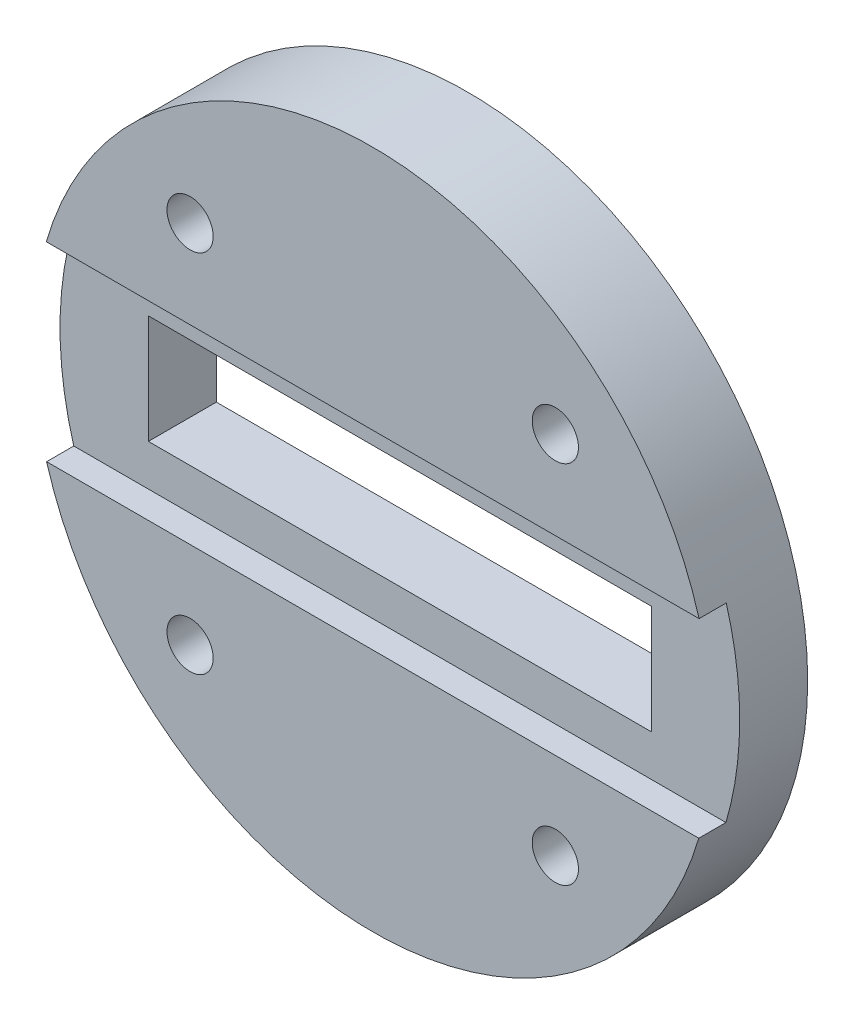
ISO-10303-21;
HEADER;
FILE_DESCRIPTION(('STEP AP214'),'2;1');
FILE_NAME('part.step','',(''),(''),'','','');
FILE_SCHEMA(('AUTOMOTIVE_DESIGN { 1 0 10303 214 1 1 1 1 }'));
ENDSEC;
DATA;
#1=APPLICATION_CONTEXT('core data for automotive mechanical design processes');
#2=APPLICATION_PROTOCOL_DEFINITION('international standard','automotive_design',2000,#1);
#3=PRODUCT_CONTEXT('',#1,'mechanical');
#4=PRODUCT('Part','Part','',(#3));
#5=PRODUCT_RELATED_PRODUCT_CATEGORY('part','',(#4));
#6=PRODUCT_DEFINITION_FORMATION('','',#4);
#7=PRODUCT_DEFINITION_CONTEXT('part definition',#1,'design');
#8=PRODUCT_DEFINITION('design','',#6,#7);
#9=PRODUCT_DEFINITION_SHAPE('','',#8);
#10=(LENGTH_UNIT() NAMED_UNIT(*) SI_UNIT(.MILLI.,.METRE.));
#11=(NAMED_UNIT(*) PLANE_ANGLE_UNIT() SI_UNIT($,.RADIAN.));
#12=(NAMED_UNIT(*) SI_UNIT($,.STERADIAN.) SOLID_ANGLE_UNIT());
#13=UNCERTAINTY_MEASURE_WITH_UNIT(LENGTH_MEASURE(1.E-05),#10,'distance_accuracy_value','');
#14=(GEOMETRIC_REPRESENTATION_CONTEXT(3) GLOBAL_UNCERTAINTY_ASSIGNED_CONTEXT((#13)) GLOBAL_UNIT_ASSIGNED_CONTEXT((#10,
#11,#12)) REPRESENTATION_CONTEXT('',''));
#15=CARTESIAN_POINT('',(0.,0.,0.));
#16=DIRECTION('',(0.,0.,1.));
#17=DIRECTION('',(1.,0.,0.));
#18=AXIS2_PLACEMENT_3D('',#15,#16,#17);
#19=CARTESIAN_POINT('',(0.,0.,-6.9));
#20=DIRECTION('',(0.,0.,1.));
#21=DIRECTION('',(1.,0.,0.));
#22=AXIS2_PLACEMENT_3D('',#19,#20,#21);
#23=CYLINDRICAL_SURFACE('',#22,25.);
#24=CARTESIAN_POINT('',(0.,0.,-6.9));
#25=DIRECTION('',(0.,0.,1.));
#26=DIRECTION('',(1.,0.,0.));
#27=AXIS2_PLACEMENT_3D('',#24,#25,#26);
#28=CIRCLE('',#27,25.);
#29=CARTESIAN_POINT('',(25.,0.,-6.9));
#30=VERTEX_POINT('',#29);
#31=EDGE_CURVE('E217',#30,#30,#28,.T.);
#32=ORIENTED_EDGE('',*,*,#31,.T.);
#33=EDGE_LOOP('',(#32));
#34=FACE_BOUND('',#33,.T.);
#35=DIRECTION('',(0.,0.,1.));
#36=VECTOR('',#35,1.);
#37=CARTESIAN_POINT('',(-23.9890359296678,-7.03748216090868,-6.9));
#38=LINE('',#37,#36);
#39=CARTESIAN_POINT('',(-23.9890359296678,-7.03748216090868,0.1));
#40=VERTEX_POINT('',#39);
#41=CARTESIAN_POINT('',(-23.9890359296678,-7.03748216090868,-1.89747870365929));
#42=VERTEX_POINT('',#41);
#43=EDGE_CURVE('E54',#40,#42,#38,.F.);
#44=ORIENTED_EDGE('',*,*,#43,.T.);
#45=CARTESIAN_POINT('',(0.,0.,-1.89747870365929));
#46=DIRECTION('',(0.,0.,1.));
#47=DIRECTION('',(1.,0.,0.));
#48=AXIS2_PLACEMENT_3D('',#45,#46,#47);
#49=CIRCLE('',#48,25.);
#50=CARTESIAN_POINT('',(-24.0109005524644,6.96251783909132,-1.89747870365929));
#51=VERTEX_POINT('',#50);
#52=EDGE_CURVE('E104',#42,#51,#49,.F.);
#53=ORIENTED_EDGE('',*,*,#52,.T.);
#54=DIRECTION('',(0.,0.,1.));
#55=VECTOR('',#54,1.);
#56=CARTESIAN_POINT('',(-24.0109005524644,6.96251783909132,-6.9));
#57=LINE('',#56,#55);
#58=CARTESIAN_POINT('',(-24.0109005524644,6.96251783909132,0.1));
#59=VERTEX_POINT('',#58);
#60=EDGE_CURVE('E107',#51,#59,#57,.T.);
#61=ORIENTED_EDGE('',*,*,#60,.T.);
#62=CARTESIAN_POINT('',(0.,0.,0.1));
#63=DIRECTION('',(0.,0.,1.));
#64=DIRECTION('',(1.,0.,0.));
#65=AXIS2_PLACEMENT_3D('',#62,#63,#64);
#66=CIRCLE('',#65,25.);
#67=CARTESIAN_POINT('',(24.0109005524644,6.96251783909131,0.1));
#68=VERTEX_POINT('',#67);
#69=EDGE_CURVE('E200',#68,#59,#66,.T.);
#70=ORIENTED_EDGE('',*,*,#69,.F.);
#71=DIRECTION('',(0.,0.,1.));
#72=VECTOR('',#71,1.);
#73=CARTESIAN_POINT('',(24.0109005524644,6.96251783909131,-6.9));
#74=LINE('',#73,#72);
#75=CARTESIAN_POINT('',(24.0109005524644,6.96251783909131,-1.89747870365929));
#76=VERTEX_POINT('',#75);
#77=EDGE_CURVE('E123',#68,#76,#74,.F.);
#78=ORIENTED_EDGE('',*,*,#77,.T.);
#79=CARTESIAN_POINT('',(23.9890359296678,-7.03748216090869,-1.89747870365929));
#80=VERTEX_POINT('',#79);
#81=EDGE_CURVE('E115',#76,#80,#49,.F.);
#82=ORIENTED_EDGE('',*,*,#81,.T.);
#83=DIRECTION('',(0.,0.,1.));
#84=VECTOR('',#83,1.);
#85=CARTESIAN_POINT('',(23.9890359296678,-7.03748216090869,-6.9));
#86=LINE('',#85,#84);
#87=CARTESIAN_POINT('',(23.9890359296678,-7.03748216090869,0.1));
#88=VERTEX_POINT('',#87);
#89=EDGE_CURVE('E114',#80,#88,#86,.T.);
#90=ORIENTED_EDGE('',*,*,#89,.T.);
#91=EDGE_CURVE('E196',#40,#88,#66,.T.);
#92=ORIENTED_EDGE('',*,*,#91,.F.);
#93=EDGE_LOOP('',(#44,#53,#61,#70,#78,#82,#90,#92));
#94=FACE_BOUND('',#93,.T.);
#95=ADVANCED_FACE('F39',(#34,#94),#23,.T.);
#96=CARTESIAN_POINT('',(0.,0.,0.1));
#97=DIRECTION('',(0.,0.,1.));
#98=DIRECTION('',(1.,0.,0.));
#99=AXIS2_PLACEMENT_3D('',#96,#97,#98);
#100=PLANE('',#99);
#101=CARTESIAN_POINT('',(-13.4350288425444,13.4350288425444,0.1));
#102=DIRECTION('',(0.,0.,1.));
#103=DIRECTION('',(1.,0.,0.));
#104=AXIS2_PLACEMENT_3D('',#101,#102,#103);
#105=CIRCLE('',#104,1.7);
#106=CARTESIAN_POINT('',(-11.7350288425444,13.4350288425444,0.0999999999999994));
#107=VERTEX_POINT('',#106);
#108=EDGE_CURVE('E188',#107,#107,#105,.T.);
#109=ORIENTED_EDGE('',*,*,#108,.F.);
#110=EDGE_LOOP('',(#109));
#111=FACE_BOUND('',#110,.T.);
#112=CARTESIAN_POINT('',(13.4350288425444,13.4350288425444,0.1));
#113=DIRECTION('',(0.,0.,1.));
#114=DIRECTION('',(1.,0.,0.));
#115=AXIS2_PLACEMENT_3D('',#112,#113,#114);
#116=CIRCLE('',#115,1.7);
#117=CARTESIAN_POINT('',(15.1350288425444,13.4350288425444,0.0999999999999994));
#118=VERTEX_POINT('',#117);
#119=EDGE_CURVE('E192',#118,#118,#116,.T.);
#120=ORIENTED_EDGE('',*,*,#119,.F.);
#121=EDGE_LOOP('',(#120));
#122=FACE_BOUND('',#121,.T.);
#123=ORIENTED_EDGE('',*,*,#69,.T.);
#124=DIRECTION('',(1.,0.,0.));
#125=VECTOR('',#124,1.);
#126=CARTESIAN_POINT('',(0.,6.96251783909131,0.1));
#127=LINE('',#126,#125);
#128=EDGE_CURVE('E11',#59,#68,#127,.T.);
#129=ORIENTED_EDGE('',*,*,#128,.T.);
#130=EDGE_LOOP('',(#123,#129));
#131=FACE_BOUND('',#130,.T.);
#132=ADVANCED_FACE('F236',(#111,#122,#131),#100,.T.);
#133=CARTESIAN_POINT('',(-13.4350288425444,-13.4350288425444,0.1));
#134=DIRECTION('',(0.,0.,1.));
#135=DIRECTION('',(1.,0.,0.));
#136=AXIS2_PLACEMENT_3D('',#133,#134,#135);
#137=CIRCLE('',#136,1.7);
#138=CARTESIAN_POINT('',(-11.7350288425444,-13.4350288425444,0.0999999999999994));
#139=VERTEX_POINT('',#138);
#140=EDGE_CURVE('E169',#139,#139,#137,.T.);
#141=ORIENTED_EDGE('',*,*,#140,.F.);
#142=EDGE_LOOP('',(#141));
#143=FACE_BOUND('',#142,.T.);
#144=CARTESIAN_POINT('',(13.4350288425444,-13.4350288425444,0.1));
#145=DIRECTION('',(0.,0.,1.));
#146=DIRECTION('',(1.,0.,0.));
#147=AXIS2_PLACEMENT_3D('',#144,#145,#146);
#148=CIRCLE('',#147,1.7);
#149=CARTESIAN_POINT('',(15.1350288425444,-13.4350288425444,0.0999999999999994));
#150=VERTEX_POINT('',#149);
#151=EDGE_CURVE('E184',#150,#150,#148,.T.);
#152=ORIENTED_EDGE('',*,*,#151,.F.);
#153=EDGE_LOOP('',(#152));
#154=FACE_BOUND('',#153,.T.);
#155=ORIENTED_EDGE('',*,*,#91,.T.);
#156=DIRECTION('',(-1.,0.,0.));
#157=VECTOR('',#156,1.);
#158=CARTESIAN_POINT('',(0.,-7.03748216090869,0.1));
#159=LINE('',#158,#157);
#160=EDGE_CURVE('E47',#88,#40,#159,.T.);
#161=ORIENTED_EDGE('',*,*,#160,.T.);
#162=EDGE_LOOP('',(#155,#161));
#163=FACE_BOUND('',#162,.T.);
#164=ADVANCED_FACE('F225',(#143,#154,#163),#100,.T.);
#165=CARTESIAN_POINT('',(-18.5,4.,-6.9));
#166=DIRECTION('',(-1.,0.,0.));
#167=DIRECTION('',(0.,-1.,0.));
#168=AXIS2_PLACEMENT_3D('',#165,#166,#167);
#169=PLANE('',#168);
#170=DIRECTION('',(0.,1.,0.));
#171=VECTOR('',#170,1.);
#172=CARTESIAN_POINT('',(-18.5,4.,-1.89747870365929));
#173=LINE('',#172,#171);
#174=CARTESIAN_POINT('',(-18.5,-4.,-1.89747870365929));
#175=VERTEX_POINT('',#174);
#176=CARTESIAN_POINT('',(-18.5,4.,-1.89747870365929));
#177=VERTEX_POINT('',#176);
#178=EDGE_CURVE('E137',#175,#177,#173,.T.);
#179=ORIENTED_EDGE('',*,*,#178,.F.);
#180=DIRECTION('',(0.,0.,1.));
#181=VECTOR('',#180,1.);
#182=CARTESIAN_POINT('',(-18.5,-4.,-6.9));
#183=LINE('',#182,#181);
#184=CARTESIAN_POINT('',(-18.5,-4.,-6.9));
#185=VERTEX_POINT('',#184);
#186=EDGE_CURVE('E164',#185,#175,#183,.T.);
#187=ORIENTED_EDGE('',*,*,#186,.F.);
#188=DIRECTION('',(0.,-1.,0.));
#189=VECTOR('',#188,1.);
#190=CARTESIAN_POINT('',(-18.5,4.,-6.9));
#191=LINE('',#190,#189);
#192=CARTESIAN_POINT('',(-18.5,4.,-6.9));
#193=VERTEX_POINT('',#192);
#194=EDGE_CURVE('E148',#193,#185,#191,.T.);
#195=ORIENTED_EDGE('',*,*,#194,.F.);
#196=DIRECTION('',(0.,0.,1.));
#197=VECTOR('',#196,1.);
#198=CARTESIAN_POINT('',(-18.5,4.,-6.9));
#199=LINE('',#198,#197);
#200=EDGE_CURVE('E165',#193,#177,#199,.T.);
#201=ORIENTED_EDGE('',*,*,#200,.T.);
#202=EDGE_LOOP('',(#179,#187,#195,#201));
#203=FACE_BOUND('',#202,.T.);
#204=ADVANCED_FACE('F273',(#203),#169,.F.);
#205=CARTESIAN_POINT('',(-18.5,4.,-6.9));
#206=DIRECTION('',(0.,1.,0.));
#207=DIRECTION('',(0.,0.,1.));
#208=AXIS2_PLACEMENT_3D('',#205,#206,#207);
#209=PLANE('',#208);
#210=DIRECTION('',(1.,0.,0.));
#211=VECTOR('',#210,1.);
#212=CARTESIAN_POINT('',(-18.5,4.,-1.89747870365929));
#213=LINE('',#212,#211);
#214=CARTESIAN_POINT('',(18.5,4.,-1.89747870365929));
#215=VERTEX_POINT('',#214);
#216=EDGE_CURVE('E131',#177,#215,#213,.T.);
#217=ORIENTED_EDGE('',*,*,#216,.F.);
#218=ORIENTED_EDGE('',*,*,#200,.F.);
#219=DIRECTION('',(-1.,0.,0.));
#220=VECTOR('',#219,1.);
#221=CARTESIAN_POINT('',(-18.5,4.,-6.9));
#222=LINE('',#221,#220);
#223=CARTESIAN_POINT('',(18.5,4.,-6.9));
#224=VERTEX_POINT('',#223);
#225=EDGE_CURVE('E160',#224,#193,#222,.T.);
#226=ORIENTED_EDGE('',*,*,#225,.F.);
#227=DIRECTION('',(0.,0.,1.));
#228=VECTOR('',#227,1.);
#229=CARTESIAN_POINT('',(18.5,4.,-6.9));
#230=LINE('',#229,#228);
#231=EDGE_CURVE('E170',#224,#215,#230,.T.);
#232=ORIENTED_EDGE('',*,*,#231,.T.);
#233=EDGE_LOOP('',(#217,#218,#226,#232));
#234=FACE_BOUND('',#233,.T.);
#235=ADVANCED_FACE('F275',(#234),#209,.F.);
#236=CARTESIAN_POINT('',(18.5,4.,-6.9));
#237=DIRECTION('',(1.,0.,0.));
#238=DIRECTION('',(0.,1.,0.));
#239=AXIS2_PLACEMENT_3D('',#236,#237,#238);
#240=PLANE('',#239);
#241=DIRECTION('',(0.,-1.,0.));
#242=VECTOR('',#241,1.);
#243=CARTESIAN_POINT('',(18.5,4.,-1.89747870365929));
#244=LINE('',#243,#242);
#245=CARTESIAN_POINT('',(18.5,-4.,-1.89747870365929));
#246=VERTEX_POINT('',#245);
#247=EDGE_CURVE('E62',#215,#246,#244,.T.);
#248=ORIENTED_EDGE('',*,*,#247,.F.);
#249=ORIENTED_EDGE('',*,*,#231,.F.);
#250=DIRECTION('',(0.,1.,0.));
#251=VECTOR('',#250,1.);
#252=CARTESIAN_POINT('',(18.5,4.,-6.9));
#253=LINE('',#252,#251);
#254=CARTESIAN_POINT('',(18.5,-4.,-6.9));
#255=VERTEX_POINT('',#254);
#256=EDGE_CURVE('E156',#255,#224,#253,.T.);
#257=ORIENTED_EDGE('',*,*,#256,.F.);
#258=DIRECTION('',(0.,0.,1.));
#259=VECTOR('',#258,1.);
#260=CARTESIAN_POINT('',(18.5,-4.,-6.9));
#261=LINE('',#260,#259);
#262=EDGE_CURVE('E174',#255,#246,#261,.T.);
#263=ORIENTED_EDGE('',*,*,#262,.T.);
#264=EDGE_LOOP('',(#248,#249,#257,#263));
#265=FACE_BOUND('',#264,.T.);
#266=ADVANCED_FACE('F257',(#265),#240,.F.);
#267=CARTESIAN_POINT('',(-18.5,-4.,-6.9));
#268=DIRECTION('',(0.,-1.,0.));
#269=DIRECTION('',(0.,0.,-1.));
#270=AXIS2_PLACEMENT_3D('',#267,#268,#269);
#271=PLANE('',#270);
#272=DIRECTION('',(-1.,0.,0.));
#273=VECTOR('',#272,1.);
#274=CARTESIAN_POINT('',(-18.5,-4.,-1.89747870365929));
#275=LINE('',#274,#273);
#276=EDGE_CURVE('E221',#246,#175,#275,.T.);
#277=ORIENTED_EDGE('',*,*,#276,.F.);
#278=ORIENTED_EDGE('',*,*,#262,.F.);
#279=DIRECTION('',(1.,0.,0.));
#280=VECTOR('',#279,1.);
#281=CARTESIAN_POINT('',(-18.5,-4.,-6.9));
#282=LINE('',#281,#280);
#283=EDGE_CURVE('E152',#185,#255,#282,.T.);
#284=ORIENTED_EDGE('',*,*,#283,.F.);
#285=ORIENTED_EDGE('',*,*,#186,.T.);
#286=EDGE_LOOP('',(#277,#278,#284,#285));
#287=FACE_BOUND('',#286,.T.);
#288=ADVANCED_FACE('F248',(#287),#271,.F.);
#289=CARTESIAN_POINT('',(0.,0.,-6.9));
#290=DIRECTION('',(0.,0.,1.));
#291=DIRECTION('',(1.,0.,0.));
#292=AXIS2_PLACEMENT_3D('',#289,#290,#291);
#293=PLANE('',#292);
#294=ORIENTED_EDGE('',*,*,#225,.T.);
#295=ORIENTED_EDGE('',*,*,#194,.T.);
#296=ORIENTED_EDGE('',*,*,#283,.T.);
#297=ORIENTED_EDGE('',*,*,#256,.T.);
#298=EDGE_LOOP('',(#294,#295,#296,#297));
#299=FACE_BOUND('',#298,.T.);
#300=CARTESIAN_POINT('',(-13.4350288425444,-13.4350288425444,-6.9));
#301=DIRECTION('',(0.,0.,1.));
#302=DIRECTION('',(1.,0.,0.));
#303=AXIS2_PLACEMENT_3D('',#300,#301,#302);
#304=CIRCLE('',#303,1.7);
#305=CARTESIAN_POINT('',(-11.7350288425444,-13.4350288425444,-6.9));
#306=VERTEX_POINT('',#305);
#307=EDGE_CURVE('E201',#306,#306,#304,.T.);
#308=ORIENTED_EDGE('',*,*,#307,.T.);
#309=EDGE_LOOP('',(#308));
#310=FACE_BOUND('',#309,.T.);
#311=CARTESIAN_POINT('',(13.4350288425444,-13.4350288425444,-6.9));
#312=DIRECTION('',(0.,0.,1.));
#313=DIRECTION('',(1.,0.,0.));
#314=AXIS2_PLACEMENT_3D('',#311,#312,#313);
#315=CIRCLE('',#314,1.7);
#316=CARTESIAN_POINT('',(15.1350288425444,-13.4350288425444,-6.9));
#317=VERTEX_POINT('',#316);
#318=EDGE_CURVE('E205',#317,#317,#315,.T.);
#319=ORIENTED_EDGE('',*,*,#318,.T.);
#320=EDGE_LOOP('',(#319));
#321=FACE_BOUND('',#320,.T.);
#322=CARTESIAN_POINT('',(-13.4350288425444,13.4350288425444,-6.9));
#323=DIRECTION('',(0.,0.,1.));
#324=DIRECTION('',(1.,0.,0.));
#325=AXIS2_PLACEMENT_3D('',#322,#323,#324);
#326=CIRCLE('',#325,1.7);
#327=CARTESIAN_POINT('',(-11.7350288425444,13.4350288425444,-6.9));
#328=VERTEX_POINT('',#327);
#329=EDGE_CURVE('E209',#328,#328,#326,.T.);
#330=ORIENTED_EDGE('',*,*,#329,.T.);
#331=EDGE_LOOP('',(#330));
#332=FACE_BOUND('',#331,.T.);
#333=CARTESIAN_POINT('',(13.4350288425444,13.4350288425444,-6.9));
#334=DIRECTION('',(0.,0.,1.));
#335=DIRECTION('',(1.,0.,0.));
#336=AXIS2_PLACEMENT_3D('',#333,#334,#335);
#337=CIRCLE('',#336,1.7);
#338=CARTESIAN_POINT('',(15.1350288425444,13.4350288425444,-6.9));
#339=VERTEX_POINT('',#338);
#340=EDGE_CURVE('E213',#339,#339,#337,.T.);
#341=ORIENTED_EDGE('',*,*,#340,.T.);
#342=EDGE_LOOP('',(#341));
#343=FACE_BOUND('',#342,.T.);
#344=ORIENTED_EDGE('',*,*,#31,.F.);
#345=EDGE_LOOP('',(#344));
#346=FACE_BOUND('',#345,.T.);
#347=ADVANCED_FACE('F245',(#299,#310,#321,#332,#343,#346),#293,.F.);
#348=CARTESIAN_POINT('',(13.4350288425444,13.4350288425444,-6.9));
#349=DIRECTION('',(0.,0.,1.));
#350=DIRECTION('',(1.,0.,0.));
#351=AXIS2_PLACEMENT_3D('',#348,#349,#350);
#352=CYLINDRICAL_SURFACE('',#351,1.7);
#353=CARTESIAN_POINT('',(15.1350288425444,13.4350288425444,-6.9));
#354=CARTESIAN_POINT('',(15.1350288425444,13.4350288425444,-6.82708333333333));
#355=CARTESIAN_POINT('',(15.1350288425444,13.4350288425444,-6.75416666666667));
#356=CARTESIAN_POINT('',(15.1350288425444,13.4350288425444,-6.60833333333334));
#357=CARTESIAN_POINT('',(15.1350288425444,13.4350288425444,-6.53541666666667));
#358=CARTESIAN_POINT('',(15.1350288425444,13.4350288425444,-6.38958333333334));
#359=CARTESIAN_POINT('',(15.1350288425444,13.4350288425444,-6.31666666666667));
#360=CARTESIAN_POINT('',(15.1350288425444,13.4350288425444,-6.17083333333333));
#361=CARTESIAN_POINT('',(15.1350288425444,13.4350288425444,-6.09791666666667));
#362=CARTESIAN_POINT('',(15.1350288425444,13.4350288425444,-5.95208333333333));
#363=CARTESIAN_POINT('',(15.1350288425444,13.4350288425444,-5.87916666666667));
#364=CARTESIAN_POINT('',(15.1350288425444,13.4350288425444,-5.73333333333334));
#365=CARTESIAN_POINT('',(15.1350288425444,13.4350288425444,-5.66041666666667));
#366=CARTESIAN_POINT('',(15.1350288425444,13.4350288425444,-5.51458333333334));
#367=CARTESIAN_POINT('',(15.1350288425444,13.4350288425444,-5.44166666666667));
#368=CARTESIAN_POINT('',(15.1350288425444,13.4350288425444,-5.29583333333333));
#369=CARTESIAN_POINT('',(15.1350288425444,13.4350288425444,-5.22291666666667));
#370=CARTESIAN_POINT('',(15.1350288425444,13.4350288425444,-5.07708333333333));
#371=CARTESIAN_POINT('',(15.1350288425444,13.4350288425444,-5.00416666666667));
#372=CARTESIAN_POINT('',(15.1350288425444,13.4350288425444,-4.85833333333334));
#373=CARTESIAN_POINT('',(15.1350288425444,13.4350288425444,-4.78541666666667));
#374=CARTESIAN_POINT('',(15.1350288425444,13.4350288425444,-4.63958333333334));
#375=CARTESIAN_POINT('',(15.1350288425444,13.4350288425444,-4.56666666666667));
#376=CARTESIAN_POINT('',(15.1350288425444,13.4350288425444,-4.42083333333334));
#377=CARTESIAN_POINT('',(15.1350288425444,13.4350288425444,-4.34791666666667));
#378=CARTESIAN_POINT('',(15.1350288425444,13.4350288425444,-4.20208333333333));
#379=CARTESIAN_POINT('',(15.1350288425444,13.4350288425444,-4.12916666666667));
#380=CARTESIAN_POINT('',(15.1350288425444,13.4350288425444,-3.98333333333333));
#381=CARTESIAN_POINT('',(15.1350288425444,13.4350288425444,-3.91041666666667));
#382=CARTESIAN_POINT('',(15.1350288425444,13.4350288425444,-3.76458333333333));
#383=CARTESIAN_POINT('',(15.1350288425444,13.4350288425444,-3.69166666666667));
#384=CARTESIAN_POINT('',(15.1350288425444,13.4350288425444,-3.54583333333333));
#385=CARTESIAN_POINT('',(15.1350288425444,13.4350288425444,-3.47291666666667));
#386=CARTESIAN_POINT('',(15.1350288425444,13.4350288425444,-3.32708333333333));
#387=CARTESIAN_POINT('',(15.1350288425444,13.4350288425444,-3.25416666666667));
#388=CARTESIAN_POINT('',(15.1350288425444,13.4350288425444,-3.10833333333333));
#389=CARTESIAN_POINT('',(15.1350288425444,13.4350288425444,-3.03541666666667));
#390=CARTESIAN_POINT('',(15.1350288425444,13.4350288425444,-2.88958333333333));
#391=CARTESIAN_POINT('',(15.1350288425444,13.4350288425444,-2.81666666666667));
#392=CARTESIAN_POINT('',(15.1350288425444,13.4350288425444,-2.67083333333333));
#393=CARTESIAN_POINT('',(15.1350288425444,13.4350288425444,-2.59791666666667));
#394=CARTESIAN_POINT('',(15.1350288425444,13.4350288425444,-2.45208333333333));
#395=CARTESIAN_POINT('',(15.1350288425444,13.4350288425444,-2.37916666666667));
#396=CARTESIAN_POINT('',(15.1350288425444,13.4350288425444,-2.23333333333333));
#397=CARTESIAN_POINT('',(15.1350288425444,13.4350288425444,-2.16041666666667));
#398=CARTESIAN_POINT('',(15.1350288425444,13.4350288425444,-2.01458333333333));
#399=CARTESIAN_POINT('',(15.1350288425444,13.4350288425444,-1.94166666666667));
#400=CARTESIAN_POINT('',(15.1350288425444,13.4350288425444,-1.79583333333333));
#401=CARTESIAN_POINT('',(15.1350288425444,13.4350288425444,-1.72291666666667));
#402=CARTESIAN_POINT('',(15.1350288425444,13.4350288425444,-1.57708333333333));
#403=CARTESIAN_POINT('',(15.1350288425444,13.4350288425444,-1.50416666666667));
#404=CARTESIAN_POINT('',(15.1350288425444,13.4350288425444,-1.35833333333333));
#405=CARTESIAN_POINT('',(15.1350288425444,13.4350288425444,-1.28541666666667));
#406=CARTESIAN_POINT('',(15.1350288425444,13.4350288425444,-1.13958333333333));
#407=CARTESIAN_POINT('',(15.1350288425444,13.4350288425444,-1.06666666666667));
#408=CARTESIAN_POINT('',(15.1350288425444,13.4350288425444,-0.920833333333334));
#409=CARTESIAN_POINT('',(15.1350288425444,13.4350288425444,-0.847916666666667));
#410=CARTESIAN_POINT('',(15.1350288425444,13.4350288425444,-0.702083333333334));
#411=CARTESIAN_POINT('',(15.1350288425444,13.4350288425444,-0.629166666666667));
#412=CARTESIAN_POINT('',(15.1350288425444,13.4350288425444,-0.483333333333334));
#413=CARTESIAN_POINT('',(15.1350288425444,13.4350288425444,-0.410416666666667));
#414=CARTESIAN_POINT('',(15.1350288425444,13.4350288425444,-0.264583333333334));
#415=CARTESIAN_POINT('',(15.1350288425444,13.4350288425444,-0.191666666666668));
#416=CARTESIAN_POINT('',(15.1350288425444,13.4350288425444,-0.045833333333334));
#417=CARTESIAN_POINT('',(15.1350288425444,13.4350288425444,0.0270833333333328));
#418=CARTESIAN_POINT('',(15.1350288425444,13.4350288425444,0.0999999999999994));
#419=B_SPLINE_CURVE_WITH_KNOTS('',3,(#353,#354,#355,#356,#357,#358,#359,#360,#361,#362,#363,
#364,#365,#366,#367,#368,#369,#370,#371,#372,#373,#374,#375,#376,#377,#378,#379,#380,#381,#382,
#383,#384,#385,#386,#387,#388,#389,#390,#391,#392,#393,#394,#395,#396,#397,#398,#399,#400,#401,
#402,#403,#404,#405,#406,#407,#408,#409,#410,#411,#412,#413,#414,#415,#416,#417,#418),
.UNSPECIFIED.,.F.,.F.,(4,2,2,2,2,2,2,2,2,2,2,2,2,2,2,2,2,2,2,2,2,2,2,2,2,2,2,2,2,2,2,2,4),(0.,
0.218749999999999,0.4375,0.65625,0.875,1.09375,1.3125,1.53125,1.75,1.96875,2.1875,2.40625,2.625,
2.84375,3.0625,3.28125,3.5,3.71875,3.9375,4.15625,4.375,4.59375,4.8125,5.03125,5.25,5.46875,
5.6875,5.90625,6.125,6.34375,6.5625,6.78125,7.),.UNSPECIFIED.);
#420=EDGE_CURVE('BSEAM247',#339,#118,#419,.T.);
#421=ORIENTED_EDGE('',*,*,#340,.F.);
#422=ORIENTED_EDGE('',*,*,#119,.T.);
#423=ORIENTED_EDGE('',*,*,#420,.T.);
#424=ORIENTED_EDGE('',*,*,#420,.F.);
#425=EDGE_LOOP('',(#421,#423,#422,#424));
#426=FACE_BOUND('',#425,.T.);
#427=ADVANCED_FACE('F247',(#426),#352,.F.);
#428=CARTESIAN_POINT('',(-13.4350288425444,13.4350288425444,-6.9));
#429=DIRECTION('',(0.,0.,1.));
#430=DIRECTION('',(1.,0.,0.));
#431=AXIS2_PLACEMENT_3D('',#428,#429,#430);
#432=CYLINDRICAL_SURFACE('',#431,1.7);
#433=CARTESIAN_POINT('',(-11.7350288425444,13.4350288425444,-6.9));
#434=CARTESIAN_POINT('',(-11.7350288425444,13.4350288425444,-6.82708333333333));
#435=CARTESIAN_POINT('',(-11.7350288425444,13.4350288425444,-6.75416666666667));
#436=CARTESIAN_POINT('',(-11.7350288425444,13.4350288425444,-6.60833333333334));
#437=CARTESIAN_POINT('',(-11.7350288425444,13.4350288425444,-6.53541666666667));
#438=CARTESIAN_POINT('',(-11.7350288425444,13.4350288425444,-6.38958333333334));
#439=CARTESIAN_POINT('',(-11.7350288425444,13.4350288425444,-6.31666666666667));
#440=CARTESIAN_POINT('',(-11.7350288425444,13.4350288425444,-6.17083333333333));
#441=CARTESIAN_POINT('',(-11.7350288425444,13.4350288425444,-6.09791666666667));
#442=CARTESIAN_POINT('',(-11.7350288425444,13.4350288425444,-5.95208333333333));
#443=CARTESIAN_POINT('',(-11.7350288425444,13.4350288425444,-5.87916666666667));
#444=CARTESIAN_POINT('',(-11.7350288425444,13.4350288425444,-5.73333333333334));
#445=CARTESIAN_POINT('',(-11.7350288425444,13.4350288425444,-5.66041666666667));
#446=CARTESIAN_POINT('',(-11.7350288425444,13.4350288425444,-5.51458333333334));
#447=CARTESIAN_POINT('',(-11.7350288425444,13.4350288425444,-5.44166666666667));
#448=CARTESIAN_POINT('',(-11.7350288425444,13.4350288425444,-5.29583333333333));
#449=CARTESIAN_POINT('',(-11.7350288425444,13.4350288425444,-5.22291666666667));
#450=CARTESIAN_POINT('',(-11.7350288425444,13.4350288425444,-5.07708333333333));
#451=CARTESIAN_POINT('',(-11.7350288425444,13.4350288425444,-5.00416666666667));
#452=CARTESIAN_POINT('',(-11.7350288425444,13.4350288425444,-4.85833333333334));
#453=CARTESIAN_POINT('',(-11.7350288425444,13.4350288425444,-4.78541666666667));
#454=CARTESIAN_POINT('',(-11.7350288425444,13.4350288425444,-4.63958333333334));
#455=CARTESIAN_POINT('',(-11.7350288425444,13.4350288425444,-4.56666666666667));
#456=CARTESIAN_POINT('',(-11.7350288425444,13.4350288425444,-4.42083333333334));
#457=CARTESIAN_POINT('',(-11.7350288425444,13.4350288425444,-4.34791666666667));
#458=CARTESIAN_POINT('',(-11.7350288425444,13.4350288425444,-4.20208333333333));
#459=CARTESIAN_POINT('',(-11.7350288425444,13.4350288425444,-4.12916666666667));
#460=CARTESIAN_POINT('',(-11.7350288425444,13.4350288425444,-3.98333333333333));
#461=CARTESIAN_POINT('',(-11.7350288425444,13.4350288425444,-3.91041666666667));
#462=CARTESIAN_POINT('',(-11.7350288425444,13.4350288425444,-3.76458333333333));
#463=CARTESIAN_POINT('',(-11.7350288425444,13.4350288425444,-3.69166666666667));
#464=CARTESIAN_POINT('',(-11.7350288425444,13.4350288425444,-3.54583333333333));
#465=CARTESIAN_POINT('',(-11.7350288425444,13.4350288425444,-3.47291666666667));
#466=CARTESIAN_POINT('',(-11.7350288425444,13.4350288425444,-3.32708333333333));
#467=CARTESIAN_POINT('',(-11.7350288425444,13.4350288425444,-3.25416666666667));
#468=CARTESIAN_POINT('',(-11.7350288425444,13.4350288425444,-3.10833333333333));
#469=CARTESIAN_POINT('',(-11.7350288425444,13.4350288425444,-3.03541666666667));
#470=CARTESIAN_POINT('',(-11.7350288425444,13.4350288425444,-2.88958333333333));
#471=CARTESIAN_POINT('',(-11.7350288425444,13.4350288425444,-2.81666666666667));
#472=CARTESIAN_POINT('',(-11.7350288425444,13.4350288425444,-2.67083333333333));
#473=CARTESIAN_POINT('',(-11.7350288425444,13.4350288425444,-2.59791666666667));
#474=CARTESIAN_POINT('',(-11.7350288425444,13.4350288425444,-2.45208333333333));
#475=CARTESIAN_POINT('',(-11.7350288425444,13.4350288425444,-2.37916666666667));
#476=CARTESIAN_POINT('',(-11.7350288425444,13.4350288425444,-2.23333333333333));
#477=CARTESIAN_POINT('',(-11.7350288425444,13.4350288425444,-2.16041666666667));
#478=CARTESIAN_POINT('',(-11.7350288425444,13.4350288425444,-2.01458333333333));
#479=CARTESIAN_POINT('',(-11.7350288425444,13.4350288425444,-1.94166666666667));
#480=CARTESIAN_POINT('',(-11.7350288425444,13.4350288425444,-1.79583333333333));
#481=CARTESIAN_POINT('',(-11.7350288425444,13.4350288425444,-1.72291666666667));
#482=CARTESIAN_POINT('',(-11.7350288425444,13.4350288425444,-1.57708333333333));
#483=CARTESIAN_POINT('',(-11.7350288425444,13.4350288425444,-1.50416666666667));
#484=CARTESIAN_POINT('',(-11.7350288425444,13.4350288425444,-1.35833333333333));
#485=CARTESIAN_POINT('',(-11.7350288425444,13.4350288425444,-1.28541666666667));
#486=CARTESIAN_POINT('',(-11.7350288425444,13.4350288425444,-1.13958333333333));
#487=CARTESIAN_POINT('',(-11.7350288425444,13.4350288425444,-1.06666666666667));
#488=CARTESIAN_POINT('',(-11.7350288425444,13.4350288425444,-0.920833333333334));
#489=CARTESIAN_POINT('',(-11.7350288425444,13.4350288425444,-0.847916666666667));
#490=CARTESIAN_POINT('',(-11.7350288425444,13.4350288425444,-0.702083333333334));
#491=CARTESIAN_POINT('',(-11.7350288425444,13.4350288425444,-0.629166666666667));
#492=CARTESIAN_POINT('',(-11.7350288425444,13.4350288425444,-0.483333333333334));
#493=CARTESIAN_POINT('',(-11.7350288425444,13.4350288425444,-0.410416666666667));
#494=CARTESIAN_POINT('',(-11.7350288425444,13.4350288425444,-0.264583333333334));
#495=CARTESIAN_POINT('',(-11.7350288425444,13.4350288425444,-0.191666666666668));
#496=CARTESIAN_POINT('',(-11.7350288425444,13.4350288425444,-0.045833333333334));
#497=CARTESIAN_POINT('',(-11.7350288425444,13.4350288425444,0.0270833333333328));
#498=CARTESIAN_POINT('',(-11.7350288425444,13.4350288425444,0.0999999999999994));
#499=B_SPLINE_CURVE_WITH_KNOTS('',3,(#433,#434,#435,#436,#437,#438,#439,#440,#441,#442,#443,
#444,#445,#446,#447,#448,#449,#450,#451,#452,#453,#454,#455,#456,#457,#458,#459,#460,#461,#462,
#463,#464,#465,#466,#467,#468,#469,#470,#471,#472,#473,#474,#475,#476,#477,#478,#479,#480,#481,
#482,#483,#484,#485,#486,#487,#488,#489,#490,#491,#492,#493,#494,#495,#496,#497,#498),
.UNSPECIFIED.,.F.,.F.,(4,2,2,2,2,2,2,2,2,2,2,2,2,2,2,2,2,2,2,2,2,2,2,2,2,2,2,2,2,2,2,2,4),(0.,
0.218749999999999,0.4375,0.65625,0.875,1.09375,1.3125,1.53125,1.75,1.96875,2.1875,2.40625,2.625,
2.84375,3.0625,3.28125,3.5,3.71875,3.9375,4.15625,4.375,4.59375,4.8125,5.03125,5.25,5.46875,
5.6875,5.90625,6.125,6.34375,6.5625,6.78125,7.),.UNSPECIFIED.);
#500=EDGE_CURVE('BSEAM254',#328,#107,#499,.T.);
#501=ORIENTED_EDGE('',*,*,#329,.F.);
#502=ORIENTED_EDGE('',*,*,#108,.T.);
#503=ORIENTED_EDGE('',*,*,#500,.T.);
#504=ORIENTED_EDGE('',*,*,#500,.F.);
#505=EDGE_LOOP('',(#501,#503,#502,#504));
#506=FACE_BOUND('',#505,.T.);
#507=ADVANCED_FACE('F254',(#506),#432,.F.);
#508=CARTESIAN_POINT('',(13.4350288425444,-13.4350288425444,-6.9));
#509=DIRECTION('',(0.,0.,1.));
#510=DIRECTION('',(1.,0.,0.));
#511=AXIS2_PLACEMENT_3D('',#508,#509,#510);
#512=CYLINDRICAL_SURFACE('',#511,1.7);
#513=CARTESIAN_POINT('',(15.1350288425444,-13.4350288425444,-6.9));
#514=CARTESIAN_POINT('',(15.1350288425444,-13.4350288425444,-6.82708333333333));
#515=CARTESIAN_POINT('',(15.1350288425444,-13.4350288425444,-6.75416666666667));
#516=CARTESIAN_POINT('',(15.1350288425444,-13.4350288425444,-6.60833333333334));
#517=CARTESIAN_POINT('',(15.1350288425444,-13.4350288425444,-6.53541666666667));
#518=CARTESIAN_POINT('',(15.1350288425444,-13.4350288425444,-6.38958333333334));
#519=CARTESIAN_POINT('',(15.1350288425444,-13.4350288425444,-6.31666666666667));
#520=CARTESIAN_POINT('',(15.1350288425444,-13.4350288425444,-6.17083333333333));
#521=CARTESIAN_POINT('',(15.1350288425444,-13.4350288425444,-6.09791666666667));
#522=CARTESIAN_POINT('',(15.1350288425444,-13.4350288425444,-5.95208333333333));
#523=CARTESIAN_POINT('',(15.1350288425444,-13.4350288425444,-5.87916666666667));
#524=CARTESIAN_POINT('',(15.1350288425444,-13.4350288425444,-5.73333333333334));
#525=CARTESIAN_POINT('',(15.1350288425444,-13.4350288425444,-5.66041666666667));
#526=CARTESIAN_POINT('',(15.1350288425444,-13.4350288425444,-5.51458333333334));
#527=CARTESIAN_POINT('',(15.1350288425444,-13.4350288425444,-5.44166666666667));
#528=CARTESIAN_POINT('',(15.1350288425444,-13.4350288425444,-5.29583333333333));
#529=CARTESIAN_POINT('',(15.1350288425444,-13.4350288425444,-5.22291666666667));
#530=CARTESIAN_POINT('',(15.1350288425444,-13.4350288425444,-5.07708333333333));
#531=CARTESIAN_POINT('',(15.1350288425444,-13.4350288425444,-5.00416666666667));
#532=CARTESIAN_POINT('',(15.1350288425444,-13.4350288425444,-4.85833333333334));
#533=CARTESIAN_POINT('',(15.1350288425444,-13.4350288425444,-4.78541666666667));
#534=CARTESIAN_POINT('',(15.1350288425444,-13.4350288425444,-4.63958333333334));
#535=CARTESIAN_POINT('',(15.1350288425444,-13.4350288425444,-4.56666666666667));
#536=CARTESIAN_POINT('',(15.1350288425444,-13.4350288425444,-4.42083333333334));
#537=CARTESIAN_POINT('',(15.1350288425444,-13.4350288425444,-4.34791666666667));
#538=CARTESIAN_POINT('',(15.1350288425444,-13.4350288425444,-4.20208333333333));
#539=CARTESIAN_POINT('',(15.1350288425444,-13.4350288425444,-4.12916666666667));
#540=CARTESIAN_POINT('',(15.1350288425444,-13.4350288425444,-3.98333333333333));
#541=CARTESIAN_POINT('',(15.1350288425444,-13.4350288425444,-3.91041666666667));
#542=CARTESIAN_POINT('',(15.1350288425444,-13.4350288425444,-3.76458333333333));
#543=CARTESIAN_POINT('',(15.1350288425444,-13.4350288425444,-3.69166666666667));
#544=CARTESIAN_POINT('',(15.1350288425444,-13.4350288425444,-3.54583333333333));
#545=CARTESIAN_POINT('',(15.1350288425444,-13.4350288425444,-3.47291666666667));
#546=CARTESIAN_POINT('',(15.1350288425444,-13.4350288425444,-3.32708333333333));
#547=CARTESIAN_POINT('',(15.1350288425444,-13.4350288425444,-3.25416666666667));
#548=CARTESIAN_POINT('',(15.1350288425444,-13.4350288425444,-3.10833333333333));
#549=CARTESIAN_POINT('',(15.1350288425444,-13.4350288425444,-3.03541666666667));
#550=CARTESIAN_POINT('',(15.1350288425444,-13.4350288425444,-2.88958333333333));
#551=CARTESIAN_POINT('',(15.1350288425444,-13.4350288425444,-2.81666666666667));
#552=CARTESIAN_POINT('',(15.1350288425444,-13.4350288425444,-2.67083333333333));
#553=CARTESIAN_POINT('',(15.1350288425444,-13.4350288425444,-2.59791666666667));
#554=CARTESIAN_POINT('',(15.1350288425444,-13.4350288425444,-2.45208333333333));
#555=CARTESIAN_POINT('',(15.1350288425444,-13.4350288425444,-2.37916666666667));
#556=CARTESIAN_POINT('',(15.1350288425444,-13.4350288425444,-2.23333333333333));
#557=CARTESIAN_POINT('',(15.1350288425444,-13.4350288425444,-2.16041666666667));
#558=CARTESIAN_POINT('',(15.1350288425444,-13.4350288425444,-2.01458333333333));
#559=CARTESIAN_POINT('',(15.1350288425444,-13.4350288425444,-1.94166666666667));
#560=CARTESIAN_POINT('',(15.1350288425444,-13.4350288425444,-1.79583333333333));
#561=CARTESIAN_POINT('',(15.1350288425444,-13.4350288425444,-1.72291666666667));
#562=CARTESIAN_POINT('',(15.1350288425444,-13.4350288425444,-1.57708333333333));
#563=CARTESIAN_POINT('',(15.1350288425444,-13.4350288425444,-1.50416666666667));
#564=CARTESIAN_POINT('',(15.1350288425444,-13.4350288425444,-1.35833333333333));
#565=CARTESIAN_POINT('',(15.1350288425444,-13.4350288425444,-1.28541666666667));
#566=CARTESIAN_POINT('',(15.1350288425444,-13.4350288425444,-1.13958333333333));
#567=CARTESIAN_POINT('',(15.1350288425444,-13.4350288425444,-1.06666666666667));
#568=CARTESIAN_POINT('',(15.1350288425444,-13.4350288425444,-0.920833333333334));
#569=CARTESIAN_POINT('',(15.1350288425444,-13.4350288425444,-0.847916666666667));
#570=CARTESIAN_POINT('',(15.1350288425444,-13.4350288425444,-0.702083333333334));
#571=CARTESIAN_POINT('',(15.1350288425444,-13.4350288425444,-0.629166666666667));
#572=CARTESIAN_POINT('',(15.1350288425444,-13.4350288425444,-0.483333333333334));
#573=CARTESIAN_POINT('',(15.1350288425444,-13.4350288425444,-0.410416666666667));
#574=CARTESIAN_POINT('',(15.1350288425444,-13.4350288425444,-0.264583333333334));
#575=CARTESIAN_POINT('',(15.1350288425444,-13.4350288425444,-0.191666666666668));
#576=CARTESIAN_POINT('',(15.1350288425444,-13.4350288425444,-0.045833333333334));
#577=CARTESIAN_POINT('',(15.1350288425444,-13.4350288425444,0.0270833333333328));
#578=CARTESIAN_POINT('',(15.1350288425444,-13.4350288425444,0.0999999999999994));
#579=B_SPLINE_CURVE_WITH_KNOTS('',3,(#513,#514,#515,#516,#517,#518,#519,#520,#521,#522,#523,
#524,#525,#526,#527,#528,#529,#530,#531,#532,#533,#534,#535,#536,#537,#538,#539,#540,#541,#542,
#543,#544,#545,#546,#547,#548,#549,#550,#551,#552,#553,#554,#555,#556,#557,#558,#559,#560,#561,
#562,#563,#564,#565,#566,#567,#568,#569,#570,#571,#572,#573,#574,#575,#576,#577,#578),
.UNSPECIFIED.,.F.,.F.,(4,2,2,2,2,2,2,2,2,2,2,2,2,2,2,2,2,2,2,2,2,2,2,2,2,2,2,2,2,2,2,2,4),(0.,
0.218749999999999,0.4375,0.65625,0.875,1.09375,1.3125,1.53125,1.75,1.96875,2.1875,2.40625,2.625,
2.84375,3.0625,3.28125,3.5,3.71875,3.9375,4.15625,4.375,4.59375,4.8125,5.03125,5.25,5.46875,
5.6875,5.90625,6.125,6.34375,6.5625,6.78125,7.),.UNSPECIFIED.);
#580=EDGE_CURVE('BSEAM264',#317,#150,#579,.T.);
#581=ORIENTED_EDGE('',*,*,#318,.F.);
#582=ORIENTED_EDGE('',*,*,#151,.T.);
#583=ORIENTED_EDGE('',*,*,#580,.T.);
#584=ORIENTED_EDGE('',*,*,#580,.F.);
#585=EDGE_LOOP('',(#581,#583,#582,#584));
#586=FACE_BOUND('',#585,.T.);
#587=ADVANCED_FACE('F264',(#586),#512,.F.);
#588=CARTESIAN_POINT('',(-13.4350288425444,-13.4350288425444,-6.9));
#589=DIRECTION('',(0.,0.,1.));
#590=DIRECTION('',(1.,0.,0.));
#591=AXIS2_PLACEMENT_3D('',#588,#589,#590);
#592=CYLINDRICAL_SURFACE('',#591,1.7);
#593=CARTESIAN_POINT('',(-11.7350288425444,-13.4350288425444,-6.9));
#594=CARTESIAN_POINT('',(-11.7350288425444,-13.4350288425444,-6.82708333333333));
#595=CARTESIAN_POINT('',(-11.7350288425444,-13.4350288425444,-6.75416666666667));
#596=CARTESIAN_POINT('',(-11.7350288425444,-13.4350288425444,-6.60833333333334));
#597=CARTESIAN_POINT('',(-11.7350288425444,-13.4350288425444,-6.53541666666667));
#598=CARTESIAN_POINT('',(-11.7350288425444,-13.4350288425444,-6.38958333333334));
#599=CARTESIAN_POINT('',(-11.7350288425444,-13.4350288425444,-6.31666666666667));
#600=CARTESIAN_POINT('',(-11.7350288425444,-13.4350288425444,-6.17083333333333));
#601=CARTESIAN_POINT('',(-11.7350288425444,-13.4350288425444,-6.09791666666667));
#602=CARTESIAN_POINT('',(-11.7350288425444,-13.4350288425444,-5.95208333333333));
#603=CARTESIAN_POINT('',(-11.7350288425444,-13.4350288425444,-5.87916666666667));
#604=CARTESIAN_POINT('',(-11.7350288425444,-13.4350288425444,-5.73333333333334));
#605=CARTESIAN_POINT('',(-11.7350288425444,-13.4350288425444,-5.66041666666667));
#606=CARTESIAN_POINT('',(-11.7350288425444,-13.4350288425444,-5.51458333333334));
#607=CARTESIAN_POINT('',(-11.7350288425444,-13.4350288425444,-5.44166666666667));
#608=CARTESIAN_POINT('',(-11.7350288425444,-13.4350288425444,-5.29583333333333));
#609=CARTESIAN_POINT('',(-11.7350288425444,-13.4350288425444,-5.22291666666667));
#610=CARTESIAN_POINT('',(-11.7350288425444,-13.4350288425444,-5.07708333333333));
#611=CARTESIAN_POINT('',(-11.7350288425444,-13.4350288425444,-5.00416666666667));
#612=CARTESIAN_POINT('',(-11.7350288425444,-13.4350288425444,-4.85833333333334));
#613=CARTESIAN_POINT('',(-11.7350288425444,-13.4350288425444,-4.78541666666667));
#614=CARTESIAN_POINT('',(-11.7350288425444,-13.4350288425444,-4.63958333333334));
#615=CARTESIAN_POINT('',(-11.7350288425444,-13.4350288425444,-4.56666666666667));
#616=CARTESIAN_POINT('',(-11.7350288425444,-13.4350288425444,-4.42083333333334));
#617=CARTESIAN_POINT('',(-11.7350288425444,-13.4350288425444,-4.34791666666667));
#618=CARTESIAN_POINT('',(-11.7350288425444,-13.4350288425444,-4.20208333333333));
#619=CARTESIAN_POINT('',(-11.7350288425444,-13.4350288425444,-4.12916666666667));
#620=CARTESIAN_POINT('',(-11.7350288425444,-13.4350288425444,-3.98333333333333));
#621=CARTESIAN_POINT('',(-11.7350288425444,-13.4350288425444,-3.91041666666667));
#622=CARTESIAN_POINT('',(-11.7350288425444,-13.4350288425444,-3.76458333333333));
#623=CARTESIAN_POINT('',(-11.7350288425444,-13.4350288425444,-3.69166666666667));
#624=CARTESIAN_POINT('',(-11.7350288425444,-13.4350288425444,-3.54583333333333));
#625=CARTESIAN_POINT('',(-11.7350288425444,-13.4350288425444,-3.47291666666667));
#626=CARTESIAN_POINT('',(-11.7350288425444,-13.4350288425444,-3.32708333333333));
#627=CARTESIAN_POINT('',(-11.7350288425444,-13.4350288425444,-3.25416666666667));
#628=CARTESIAN_POINT('',(-11.7350288425444,-13.4350288425444,-3.10833333333333));
#629=CARTESIAN_POINT('',(-11.7350288425444,-13.4350288425444,-3.03541666666667));
#630=CARTESIAN_POINT('',(-11.7350288425444,-13.4350288425444,-2.88958333333333));
#631=CARTESIAN_POINT('',(-11.7350288425444,-13.4350288425444,-2.81666666666667));
#632=CARTESIAN_POINT('',(-11.7350288425444,-13.4350288425444,-2.67083333333333));
#633=CARTESIAN_POINT('',(-11.7350288425444,-13.4350288425444,-2.59791666666667));
#634=CARTESIAN_POINT('',(-11.7350288425444,-13.4350288425444,-2.45208333333333));
#635=CARTESIAN_POINT('',(-11.7350288425444,-13.4350288425444,-2.37916666666667));
#636=CARTESIAN_POINT('',(-11.7350288425444,-13.4350288425444,-2.23333333333333));
#637=CARTESIAN_POINT('',(-11.7350288425444,-13.4350288425444,-2.16041666666667));
#638=CARTESIAN_POINT('',(-11.7350288425444,-13.4350288425444,-2.01458333333333));
#639=CARTESIAN_POINT('',(-11.7350288425444,-13.4350288425444,-1.94166666666667));
#640=CARTESIAN_POINT('',(-11.7350288425444,-13.4350288425444,-1.79583333333333));
#641=CARTESIAN_POINT('',(-11.7350288425444,-13.4350288425444,-1.72291666666667));
#642=CARTESIAN_POINT('',(-11.7350288425444,-13.4350288425444,-1.57708333333333));
#643=CARTESIAN_POINT('',(-11.7350288425444,-13.4350288425444,-1.50416666666667));
#644=CARTESIAN_POINT('',(-11.7350288425444,-13.4350288425444,-1.35833333333333));
#645=CARTESIAN_POINT('',(-11.7350288425444,-13.4350288425444,-1.28541666666667));
#646=CARTESIAN_POINT('',(-11.7350288425444,-13.4350288425444,-1.13958333333333));
#647=CARTESIAN_POINT('',(-11.7350288425444,-13.4350288425444,-1.06666666666667));
#648=CARTESIAN_POINT('',(-11.7350288425444,-13.4350288425444,-0.920833333333334));
#649=CARTESIAN_POINT('',(-11.7350288425444,-13.4350288425444,-0.847916666666667));
#650=CARTESIAN_POINT('',(-11.7350288425444,-13.4350288425444,-0.702083333333334));
#651=CARTESIAN_POINT('',(-11.7350288425444,-13.4350288425444,-0.629166666666667));
#652=CARTESIAN_POINT('',(-11.7350288425444,-13.4350288425444,-0.483333333333334));
#653=CARTESIAN_POINT('',(-11.7350288425444,-13.4350288425444,-0.410416666666667));
#654=CARTESIAN_POINT('',(-11.7350288425444,-13.4350288425444,-0.264583333333334));
#655=CARTESIAN_POINT('',(-11.7350288425444,-13.4350288425444,-0.191666666666668));
#656=CARTESIAN_POINT('',(-11.7350288425444,-13.4350288425444,-0.045833333333334));
#657=CARTESIAN_POINT('',(-11.7350288425444,-13.4350288425444,0.0270833333333328));
#658=CARTESIAN_POINT('',(-11.7350288425444,-13.4350288425444,0.0999999999999994));
#659=B_SPLINE_CURVE_WITH_KNOTS('',3,(#593,#594,#595,#596,#597,#598,#599,#600,#601,#602,#603,
#604,#605,#606,#607,#608,#609,#610,#611,#612,#613,#614,#615,#616,#617,#618,#619,#620,#621,#622,
#623,#624,#625,#626,#627,#628,#629,#630,#631,#632,#633,#634,#635,#636,#637,#638,#639,#640,#641,
#642,#643,#644,#645,#646,#647,#648,#649,#650,#651,#652,#653,#654,#655,#656,#657,#658),
.UNSPECIFIED.,.F.,.F.,(4,2,2,2,2,2,2,2,2,2,2,2,2,2,2,2,2,2,2,2,2,2,2,2,2,2,2,2,2,2,2,2,4),(0.,
0.218749999999999,0.4375,0.65625,0.875,1.09375,1.3125,1.53125,1.75,1.96875,2.1875,2.40625,2.625,
2.84375,3.0625,3.28125,3.5,3.71875,3.9375,4.15625,4.375,4.59375,4.8125,5.03125,5.25,5.46875,
5.6875,5.90625,6.125,6.34375,6.5625,6.78125,7.),.UNSPECIFIED.);
#660=EDGE_CURVE('BSEAM268',#306,#139,#659,.T.);
#661=ORIENTED_EDGE('',*,*,#307,.F.);
#662=ORIENTED_EDGE('',*,*,#140,.T.);
#663=ORIENTED_EDGE('',*,*,#660,.T.);
#664=ORIENTED_EDGE('',*,*,#660,.F.);
#665=EDGE_LOOP('',(#661,#663,#662,#664));
#666=FACE_BOUND('',#665,.T.);
#667=ADVANCED_FACE('F268',(#666),#592,.F.);
#668=CARTESIAN_POINT('',(-25.,-7.03748216090868,-1.89747870365929));
#669=DIRECTION('',(0.,0.,1.));
#670=DIRECTION('',(1.,0.,0.));
#671=AXIS2_PLACEMENT_3D('',#668,#669,#670);
#672=PLANE('',#671);
#673=DIRECTION('',(1.,0.,0.));
#674=VECTOR('',#673,1.);
#675=CARTESIAN_POINT('',(-25.,-7.03748216090868,-1.89747870365929));
#676=LINE('',#675,#674);
#677=EDGE_CURVE('E127',#42,#80,#676,.T.);
#678=ORIENTED_EDGE('',*,*,#677,.T.);
#679=ORIENTED_EDGE('',*,*,#81,.F.);
#680=DIRECTION('',(1.,0.,0.));
#681=VECTOR('',#680,1.);
#682=CARTESIAN_POINT('',(-25.,6.96251783909132,-1.89747870365929));
#683=LINE('',#682,#681);
#684=EDGE_CURVE('E120',#51,#76,#683,.T.);
#685=ORIENTED_EDGE('',*,*,#684,.F.);
#686=ORIENTED_EDGE('',*,*,#52,.F.);
#687=EDGE_LOOP('',(#678,#679,#685,#686));
#688=FACE_BOUND('',#687,.T.);
#689=ORIENTED_EDGE('',*,*,#178,.T.);
#690=ORIENTED_EDGE('',*,*,#216,.T.);
#691=ORIENTED_EDGE('',*,*,#247,.T.);
#692=ORIENTED_EDGE('',*,*,#276,.T.);
#693=EDGE_LOOP('',(#689,#690,#691,#692));
#694=FACE_BOUND('',#693,.T.);
#695=ADVANCED_FACE('F125',(#688,#694),#672,.T.);
#696=CARTESIAN_POINT('',(-25.,6.96251783909132,0.942521296340706));
#697=DIRECTION('',(0.,-1.,0.));
#698=DIRECTION('',(1.,0.,0.));
#699=AXIS2_PLACEMENT_3D('',#696,#697,#698);
#700=PLANE('',#699);
#701=ORIENTED_EDGE('',*,*,#128,.F.);
#702=ORIENTED_EDGE('',*,*,#60,.F.);
#703=ORIENTED_EDGE('',*,*,#684,.T.);
#704=ORIENTED_EDGE('',*,*,#77,.F.);
#705=EDGE_LOOP('',(#701,#702,#703,#704));
#706=FACE_BOUND('',#705,.T.);
#707=ADVANCED_FACE('F119',(#706),#700,.T.);
#708=CARTESIAN_POINT('',(-25.,-7.03748216090868,0.942521296340706));
#709=DIRECTION('',(0.,1.,0.));
#710=DIRECTION('',(-1.,0.,0.));
#711=AXIS2_PLACEMENT_3D('',#708,#709,#710);
#712=PLANE('',#711);
#713=ORIENTED_EDGE('',*,*,#160,.F.);
#714=ORIENTED_EDGE('',*,*,#89,.F.);
#715=ORIENTED_EDGE('',*,*,#677,.F.);
#716=ORIENTED_EDGE('',*,*,#43,.F.);
#717=EDGE_LOOP('',(#713,#714,#715,#716));
#718=FACE_BOUND('',#717,.T.);
#719=ADVANCED_FACE('F227',(#718),#712,.T.);
#720=CLOSED_SHELL('',(#95,#132,#164,#204,#235,#266,#288,#347,#427,#507,#587,#667,#695,#707,#719));
#721=MANIFOLD_SOLID_BREP('B2',#720);
#722=ADVANCED_BREP_SHAPE_REPRESENTATION('',(#18,#721),#14);
#723=SHAPE_DEFINITION_REPRESENTATION(#9,#722);
ENDSEC;
END-ISO-10303-21;
